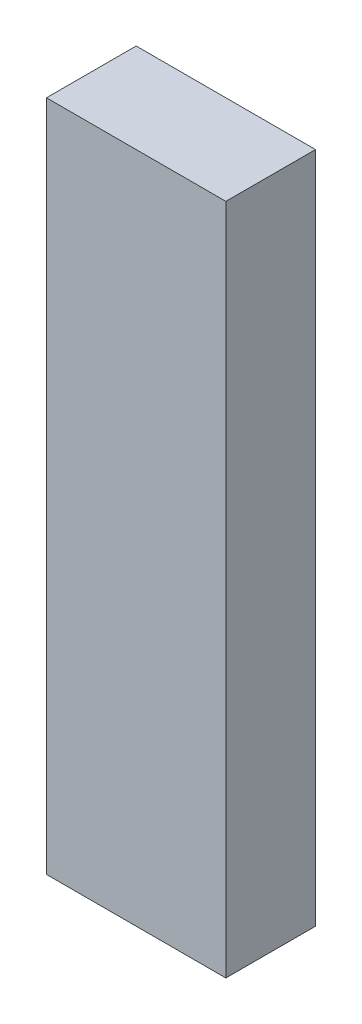
ISO-10303-21;
HEADER;
FILE_DESCRIPTION(('STEP AP214'),'2;1');
FILE_NAME('part.step','',(''),(''),'','','');
FILE_SCHEMA(('AUTOMOTIVE_DESIGN { 1 0 10303 214 1 1 1 1 }'));
ENDSEC;
DATA;
#1=APPLICATION_CONTEXT('core data for automotive mechanical design processes');
#2=APPLICATION_PROTOCOL_DEFINITION('international standard','automotive_design',2000,#1);
#3=PRODUCT_CONTEXT('',#1,'mechanical');
#4=PRODUCT('Part','Part','',(#3));
#5=PRODUCT_RELATED_PRODUCT_CATEGORY('part','',(#4));
#6=PRODUCT_DEFINITION_FORMATION('','',#4);
#7=PRODUCT_DEFINITION_CONTEXT('part definition',#1,'design');
#8=PRODUCT_DEFINITION('design','',#6,#7);
#9=PRODUCT_DEFINITION_SHAPE('','',#8);
#10=(LENGTH_UNIT() NAMED_UNIT(*) SI_UNIT(.MILLI.,.METRE.));
#11=(NAMED_UNIT(*) PLANE_ANGLE_UNIT() SI_UNIT($,.RADIAN.));
#12=(NAMED_UNIT(*) SI_UNIT($,.STERADIAN.) SOLID_ANGLE_UNIT());
#13=UNCERTAINTY_MEASURE_WITH_UNIT(LENGTH_MEASURE(1.E-05),#10,'distance_accuracy_value','');
#14=(GEOMETRIC_REPRESENTATION_CONTEXT(3) GLOBAL_UNCERTAINTY_ASSIGNED_CONTEXT((#13)) GLOBAL_UNIT_ASSIGNED_CONTEXT((#10,
#11,#12)) REPRESENTATION_CONTEXT('',''));
#15=CARTESIAN_POINT('',(0.,0.,0.));
#16=DIRECTION('',(0.,0.,1.));
#17=DIRECTION('',(1.,0.,0.));
#18=AXIS2_PLACEMENT_3D('',#15,#16,#17);
#19=CARTESIAN_POINT('',(0.,95.25,0.));
#20=DIRECTION('',(1.,0.,0.));
#21=DIRECTION('',(0.,0.,-1.));
#22=AXIS2_PLACEMENT_3D('',#19,#20,#21);
#23=PLANE('',#22);
#24=DIRECTION('',(0.,0.,1.));
#25=VECTOR('',#24,1.);
#26=CARTESIAN_POINT('',(0.,0.,0.));
#27=LINE('',#26,#25);
#28=CARTESIAN_POINT('',(0.,0.,-12.7));
#29=VERTEX_POINT('',#28);
#30=CARTESIAN_POINT('',(0.,0.,0.));
#31=VERTEX_POINT('',#30);
#32=EDGE_CURVE('E105',#29,#31,#27,.T.);
#33=ORIENTED_EDGE('',*,*,#32,.T.);
#34=DIRECTION('',(0.,-1.,0.));
#35=VECTOR('',#34,1.);
#36=CARTESIAN_POINT('',(0.,95.25,0.));
#37=LINE('',#36,#35);
#38=CARTESIAN_POINT('',(0.,95.25,0.));
#39=VERTEX_POINT('',#38);
#40=EDGE_CURVE('E11',#39,#31,#37,.T.);
#41=ORIENTED_EDGE('',*,*,#40,.F.);
#42=DIRECTION('',(0.,0.,1.));
#43=VECTOR('',#42,1.);
#44=CARTESIAN_POINT('',(0.,95.25,0.));
#45=LINE('',#44,#43);
#46=CARTESIAN_POINT('',(0.,95.25,-12.7));
#47=VERTEX_POINT('',#46);
#48=EDGE_CURVE('E89',#47,#39,#45,.T.);
#49=ORIENTED_EDGE('',*,*,#48,.F.);
#50=DIRECTION('',(0.,-1.,0.));
#51=VECTOR('',#50,1.);
#52=CARTESIAN_POINT('',(0.,95.25,-12.7));
#53=LINE('',#52,#51);
#54=EDGE_CURVE('E97',#47,#29,#53,.T.);
#55=ORIENTED_EDGE('',*,*,#54,.T.);
#56=EDGE_LOOP('',(#33,#41,#49,#55));
#57=FACE_BOUND('',#56,.T.);
#58=ADVANCED_FACE('F39',(#57),#23,.F.);
#59=CARTESIAN_POINT('',(0.,95.25,0.));
#60=DIRECTION('',(0.,0.,-1.));
#61=DIRECTION('',(-1.,0.,0.));
#62=AXIS2_PLACEMENT_3D('',#59,#60,#61);
#63=PLANE('',#62);
#64=DIRECTION('',(1.,0.,0.));
#65=VECTOR('',#64,1.);
#66=CARTESIAN_POINT('',(0.,0.,0.));
#67=LINE('',#66,#65);
#68=CARTESIAN_POINT('',(25.4,0.,0.));
#69=VERTEX_POINT('',#68);
#70=EDGE_CURVE('E92',#31,#69,#67,.T.);
#71=ORIENTED_EDGE('',*,*,#70,.T.);
#72=DIRECTION('',(0.,-1.,0.));
#73=VECTOR('',#72,1.);
#74=CARTESIAN_POINT('',(25.4,95.25,0.));
#75=LINE('',#74,#73);
#76=CARTESIAN_POINT('',(25.4,95.25,0.));
#77=VERTEX_POINT('',#76);
#78=EDGE_CURVE('E50',#77,#69,#75,.T.);
#79=ORIENTED_EDGE('',*,*,#78,.F.);
#80=DIRECTION('',(1.,0.,0.));
#81=VECTOR('',#80,1.);
#82=CARTESIAN_POINT('',(0.,95.25,0.));
#83=LINE('',#82,#81);
#84=EDGE_CURVE('E82',#39,#77,#83,.T.);
#85=ORIENTED_EDGE('',*,*,#84,.F.);
#86=ORIENTED_EDGE('',*,*,#40,.T.);
#87=EDGE_LOOP('',(#71,#79,#85,#86));
#88=FACE_BOUND('',#87,.T.);
#89=ADVANCED_FACE('F93',(#88),#63,.F.);
#90=CARTESIAN_POINT('',(25.4,95.25,0.));
#91=DIRECTION('',(-1.,0.,0.));
#92=DIRECTION('',(0.,0.,1.));
#93=AXIS2_PLACEMENT_3D('',#90,#91,#92);
#94=PLANE('',#93);
#95=DIRECTION('',(0.,0.,-1.));
#96=VECTOR('',#95,1.);
#97=CARTESIAN_POINT('',(25.4,0.,0.));
#98=LINE('',#97,#96);
#99=CARTESIAN_POINT('',(25.4,0.,-12.7));
#100=VERTEX_POINT('',#99);
#101=EDGE_CURVE('E75',#69,#100,#98,.T.);
#102=ORIENTED_EDGE('',*,*,#101,.T.);
#103=DIRECTION('',(0.,-1.,0.));
#104=VECTOR('',#103,1.);
#105=CARTESIAN_POINT('',(25.4,95.25,-12.7));
#106=LINE('',#105,#104);
#107=CARTESIAN_POINT('',(25.4,95.25,-12.7));
#108=VERTEX_POINT('',#107);
#109=EDGE_CURVE('E94',#108,#100,#106,.T.);
#110=ORIENTED_EDGE('',*,*,#109,.F.);
#111=DIRECTION('',(0.,0.,-1.));
#112=VECTOR('',#111,1.);
#113=CARTESIAN_POINT('',(25.4,95.25,0.));
#114=LINE('',#113,#112);
#115=EDGE_CURVE('E88',#77,#108,#114,.T.);
#116=ORIENTED_EDGE('',*,*,#115,.F.);
#117=ORIENTED_EDGE('',*,*,#78,.T.);
#118=EDGE_LOOP('',(#102,#110,#116,#117));
#119=FACE_BOUND('',#118,.T.);
#120=ADVANCED_FACE('F96',(#119),#94,.F.);
#121=CARTESIAN_POINT('',(0.,95.25,-12.7));
#122=DIRECTION('',(0.,0.,1.));
#123=DIRECTION('',(1.,0.,0.));
#124=AXIS2_PLACEMENT_3D('',#121,#122,#123);
#125=PLANE('',#124);
#126=DIRECTION('',(-1.,0.,0.));
#127=VECTOR('',#126,1.);
#128=CARTESIAN_POINT('',(0.,0.,-12.7));
#129=LINE('',#128,#127);
#130=EDGE_CURVE('E76',#100,#29,#129,.T.);
#131=ORIENTED_EDGE('',*,*,#130,.T.);
#132=ORIENTED_EDGE('',*,*,#54,.F.);
#133=DIRECTION('',(-1.,0.,0.));
#134=VECTOR('',#133,1.);
#135=CARTESIAN_POINT('',(0.,95.25,-12.7));
#136=LINE('',#135,#134);
#137=EDGE_CURVE('E54',#108,#47,#136,.T.);
#138=ORIENTED_EDGE('',*,*,#137,.F.);
#139=ORIENTED_EDGE('',*,*,#109,.T.);
#140=EDGE_LOOP('',(#131,#132,#138,#139));
#141=FACE_BOUND('',#140,.T.);
#142=ADVANCED_FACE('F106',(#141),#125,.F.);
#143=CARTESIAN_POINT('',(0.,95.25,0.));
#144=DIRECTION('',(0.,-1.,0.));
#145=DIRECTION('',(0.,0.,-1.));
#146=AXIS2_PLACEMENT_3D('',#143,#144,#145);
#147=PLANE('',#146);
#148=ORIENTED_EDGE('',*,*,#48,.T.);
#149=ORIENTED_EDGE('',*,*,#84,.T.);
#150=ORIENTED_EDGE('',*,*,#115,.T.);
#151=ORIENTED_EDGE('',*,*,#137,.T.);
#152=EDGE_LOOP('',(#148,#149,#150,#151));
#153=FACE_BOUND('',#152,.T.);
#154=ADVANCED_FACE('F86',(#153),#147,.F.);
#155=CARTESIAN_POINT('',(0.,0.,0.));
#156=DIRECTION('',(0.,-1.,0.));
#157=DIRECTION('',(0.,0.,-1.));
#158=AXIS2_PLACEMENT_3D('',#155,#156,#157);
#159=PLANE('',#158);
#160=CARTESIAN_POINT('',(6.35,0.,-6.35));
#161=DIRECTION('',(0.,-1.,0.));
#162=DIRECTION('',(0.,0.,-1.));
#163=AXIS2_PLACEMENT_3D('',#160,#161,#162);
#164=CIRCLE('',#163,3.175);
#165=CARTESIAN_POINT('',(6.35,0.,-9.525));
#166=VERTEX_POINT('',#165);
#167=EDGE_CURVE('E122',#166,#166,#164,.T.);
#168=ORIENTED_EDGE('',*,*,#167,.F.);
#169=EDGE_LOOP('',(#168));
#170=FACE_BOUND('',#169,.T.);
#171=CARTESIAN_POINT('',(19.05,0.,-6.35));
#172=DIRECTION('',(0.,-1.,0.));
#173=DIRECTION('',(0.,0.,-1.));
#174=AXIS2_PLACEMENT_3D('',#171,#172,#173);
#175=CIRCLE('',#174,3.175);
#176=CARTESIAN_POINT('',(19.05,0.,-9.525));
#177=VERTEX_POINT('',#176);
#178=EDGE_CURVE('E119',#177,#177,#175,.T.);
#179=ORIENTED_EDGE('',*,*,#178,.F.);
#180=EDGE_LOOP('',(#179));
#181=FACE_BOUND('',#180,.T.);
#182=ORIENTED_EDGE('',*,*,#32,.F.);
#183=ORIENTED_EDGE('',*,*,#130,.F.);
#184=ORIENTED_EDGE('',*,*,#101,.F.);
#185=ORIENTED_EDGE('',*,*,#70,.F.);
#186=EDGE_LOOP('',(#182,#183,#184,#185));
#187=FACE_BOUND('',#186,.T.);
#188=ADVANCED_FACE('F111',(#170,#181,#187),#159,.T.);
#189=CARTESIAN_POINT('',(19.05,25.4,-6.35));
#190=DIRECTION('',(0.,-1.,0.));
#191=DIRECTION('',(0.,0.,-1.));
#192=AXIS2_PLACEMENT_3D('',#189,#190,#191);
#193=CYLINDRICAL_SURFACE('',#192,3.175);
#194=CARTESIAN_POINT('',(19.05,25.4,-6.35));
#195=DIRECTION('',(0.,-1.,0.));
#196=DIRECTION('',(0.,0.,-1.));
#197=AXIS2_PLACEMENT_3D('',#194,#195,#196);
#198=CIRCLE('',#197,3.175);
#199=CARTESIAN_POINT('',(19.05,25.4,-9.525));
#200=VERTEX_POINT('',#199);
#201=EDGE_CURVE('E117',#200,#200,#198,.T.);
#202=ORIENTED_EDGE('',*,*,#201,.F.);
#203=EDGE_LOOP('',(#202));
#204=FACE_BOUND('',#203,.T.);
#205=ORIENTED_EDGE('',*,*,#178,.T.);
#206=EDGE_LOOP('',(#205));
#207=FACE_BOUND('',#206,.T.);
#208=ADVANCED_FACE('F137',(#204,#207),#193,.F.);
#209=CARTESIAN_POINT('',(19.05,25.4,-6.35));
#210=DIRECTION('',(0.,-1.,0.));
#211=DIRECTION('',(0.,0.,-1.));
#212=AXIS2_PLACEMENT_3D('',#209,#210,#211);
#213=PLANE('',#212);
#214=ORIENTED_EDGE('',*,*,#201,.T.);
#215=EDGE_LOOP('',(#214));
#216=FACE_BOUND('',#215,.T.);
#217=ADVANCED_FACE('F133',(#216),#213,.T.);
#218=CARTESIAN_POINT('',(6.35,25.4,-6.35));
#219=DIRECTION('',(0.,-1.,0.));
#220=DIRECTION('',(0.,0.,-1.));
#221=AXIS2_PLACEMENT_3D('',#218,#219,#220);
#222=CYLINDRICAL_SURFACE('',#221,3.175);
#223=CARTESIAN_POINT('',(6.35,25.4,-6.35));
#224=DIRECTION('',(0.,-1.,0.));
#225=DIRECTION('',(0.,0.,-1.));
#226=AXIS2_PLACEMENT_3D('',#223,#224,#225);
#227=CIRCLE('',#226,3.175);
#228=CARTESIAN_POINT('',(6.35,25.4,-9.525));
#229=VERTEX_POINT('',#228);
#230=EDGE_CURVE('E103',#229,#229,#227,.T.);
#231=ORIENTED_EDGE('',*,*,#230,.F.);
#232=EDGE_LOOP('',(#231));
#233=FACE_BOUND('',#232,.T.);
#234=ORIENTED_EDGE('',*,*,#167,.T.);
#235=EDGE_LOOP('',(#234));
#236=FACE_BOUND('',#235,.T.);
#237=ADVANCED_FACE('F127',(#233,#236),#222,.F.);
#238=CARTESIAN_POINT('',(6.35,25.4,-6.35));
#239=DIRECTION('',(0.,-1.,0.));
#240=DIRECTION('',(0.,0.,-1.));
#241=AXIS2_PLACEMENT_3D('',#238,#239,#240);
#242=PLANE('',#241);
#243=ORIENTED_EDGE('',*,*,#230,.T.);
#244=EDGE_LOOP('',(#243));
#245=FACE_BOUND('',#244,.T.);
#246=ADVANCED_FACE('F126',(#245),#242,.T.);
#247=CLOSED_SHELL('',(#58,#89,#120,#142,#154,#188,#208,#217,#237,#246));
#248=MANIFOLD_SOLID_BREP('B2',#247);
#249=ADVANCED_BREP_SHAPE_REPRESENTATION('',(#18,#248),#14);
#250=SHAPE_DEFINITION_REPRESENTATION(#9,#249);
ENDSEC;
END-ISO-10303-21;
